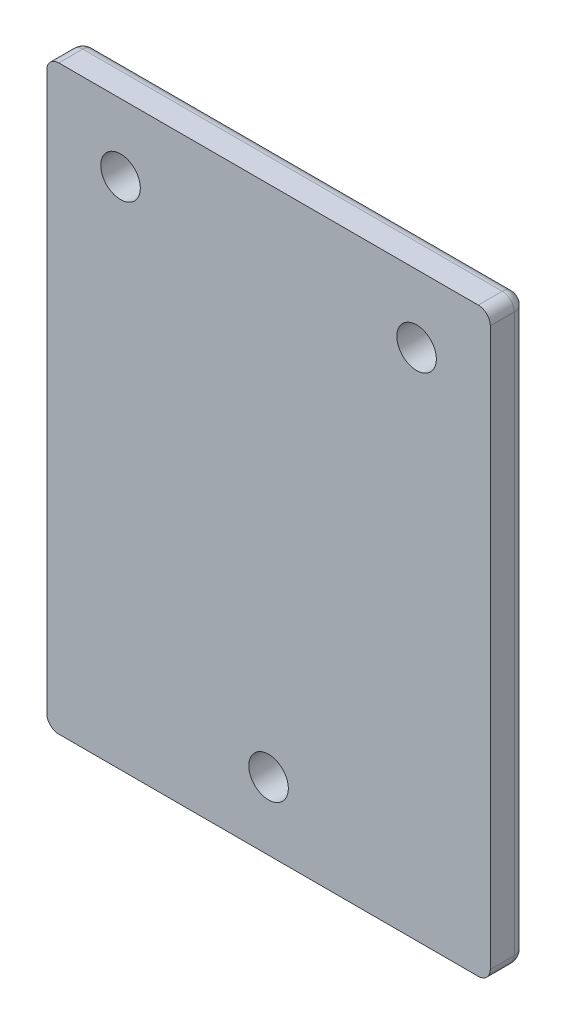
ISO-10303-21;
HEADER;
FILE_DESCRIPTION(('STEP AP214'),'2;1');
FILE_NAME('part.step','',(''),(''),'','','');
FILE_SCHEMA(('AUTOMOTIVE_DESIGN { 1 0 10303 214 1 1 1 1 }'));
ENDSEC;
DATA;
#1=APPLICATION_CONTEXT('core data for automotive mechanical design processes');
#2=APPLICATION_PROTOCOL_DEFINITION('international standard','automotive_design',2000,#1);
#3=PRODUCT_CONTEXT('',#1,'mechanical');
#4=PRODUCT('Part','Part','',(#3));
#5=PRODUCT_RELATED_PRODUCT_CATEGORY('part','',(#4));
#6=PRODUCT_DEFINITION_FORMATION('','',#4);
#7=PRODUCT_DEFINITION_CONTEXT('part definition',#1,'design');
#8=PRODUCT_DEFINITION('design','',#6,#7);
#9=PRODUCT_DEFINITION_SHAPE('','',#8);
#10=(LENGTH_UNIT() NAMED_UNIT(*) SI_UNIT(.MILLI.,.METRE.));
#11=(NAMED_UNIT(*) PLANE_ANGLE_UNIT() SI_UNIT($,.RADIAN.));
#12=(NAMED_UNIT(*) SI_UNIT($,.STERADIAN.) SOLID_ANGLE_UNIT());
#13=UNCERTAINTY_MEASURE_WITH_UNIT(LENGTH_MEASURE(1.E-05),#10,'distance_accuracy_value','');
#14=(GEOMETRIC_REPRESENTATION_CONTEXT(3) GLOBAL_UNCERTAINTY_ASSIGNED_CONTEXT((#13)) GLOBAL_UNIT_ASSIGNED_CONTEXT((#10,
#11,#12)) REPRESENTATION_CONTEXT('',''));
#15=CARTESIAN_POINT('',(0.,0.,0.));
#16=DIRECTION('',(0.,0.,1.));
#17=DIRECTION('',(1.,0.,0.));
#18=AXIS2_PLACEMENT_3D('',#15,#16,#17);
#19=CARTESIAN_POINT('',(0.,0.,3.));
#20=DIRECTION('',(0.,0.,-1.));
#21=DIRECTION('',(-1.,0.,0.));
#22=AXIS2_PLACEMENT_3D('',#19,#20,#21);
#23=PLANE('',#22);
#24=CARTESIAN_POINT('',(12.35,18.6,3.));
#25=DIRECTION('',(0.,0.,-1.));
#26=DIRECTION('',(-1.,0.,0.));
#27=AXIS2_PLACEMENT_3D('',#24,#25,#26);
#28=CIRCLE('',#27,1.64999999999999);
#29=CARTESIAN_POINT('',(10.7,18.6,3.));
#30=VERTEX_POINT('',#29);
#31=EDGE_CURVE('E197',#30,#30,#28,.T.);
#32=ORIENTED_EDGE('',*,*,#31,.T.);
#33=EDGE_LOOP('',(#32));
#34=FACE_BOUND('',#33,.T.);
#35=CARTESIAN_POINT('',(0.,-18.6,3.));
#36=DIRECTION('',(0.,0.,-1.));
#37=DIRECTION('',(-1.,0.,0.));
#38=AXIS2_PLACEMENT_3D('',#35,#36,#37);
#39=CIRCLE('',#38,1.65);
#40=CARTESIAN_POINT('',(-1.65,-18.6,3.));
#41=VERTEX_POINT('',#40);
#42=EDGE_CURVE('E210',#41,#41,#39,.F.);
#43=ORIENTED_EDGE('',*,*,#42,.F.);
#44=EDGE_LOOP('',(#43));
#45=FACE_BOUND('',#44,.T.);
#46=CARTESIAN_POINT('',(-12.35,18.6,3.));
#47=DIRECTION('',(0.,0.,-1.));
#48=DIRECTION('',(-1.,0.,0.));
#49=AXIS2_PLACEMENT_3D('',#46,#47,#48);
#50=CIRCLE('',#49,1.64999999999999);
#51=CARTESIAN_POINT('',(-14.,18.6,3.));
#52=VERTEX_POINT('',#51);
#53=EDGE_CURVE('E216',#52,#52,#50,.F.);
#54=ORIENTED_EDGE('',*,*,#53,.F.);
#55=EDGE_LOOP('',(#54));
#56=FACE_BOUND('',#55,.T.);
#57=DIRECTION('',(-1.,0.,0.));
#58=VECTOR('',#57,1.);
#59=CARTESIAN_POINT('',(-18.5,24.25,3.));
#60=LINE('',#59,#58);
#61=CARTESIAN_POINT('',(17.5,24.25,3.));
#62=VERTEX_POINT('',#61);
#63=CARTESIAN_POINT('',(-17.5,24.25,3.));
#64=VERTEX_POINT('',#63);
#65=EDGE_CURVE('E113',#62,#64,#60,.T.);
#66=ORIENTED_EDGE('',*,*,#65,.T.);
#67=CARTESIAN_POINT('',(-17.5,23.25,3.));
#68=DIRECTION('',(0.,0.,-1.));
#69=DIRECTION('',(-1.,0.,0.));
#70=AXIS2_PLACEMENT_3D('',#67,#68,#69);
#71=CIRCLE('',#70,1.);
#72=CARTESIAN_POINT('',(-18.5,23.25,3.));
#73=VERTEX_POINT('',#72);
#74=EDGE_CURVE('E11',#64,#73,#71,.F.);
#75=ORIENTED_EDGE('',*,*,#74,.T.);
#76=DIRECTION('',(0.,-1.,0.));
#77=VECTOR('',#76,1.);
#78=CARTESIAN_POINT('',(-18.5,-24.25,3.));
#79=LINE('',#78,#77);
#80=CARTESIAN_POINT('',(-18.5,-23.25,3.));
#81=VERTEX_POINT('',#80);
#82=EDGE_CURVE('E127',#73,#81,#79,.T.);
#83=ORIENTED_EDGE('',*,*,#82,.T.);
#84=CARTESIAN_POINT('',(-17.5,-23.25,3.));
#85=DIRECTION('',(0.,0.,-1.));
#86=DIRECTION('',(-1.,0.,0.));
#87=AXIS2_PLACEMENT_3D('',#84,#85,#86);
#88=CIRCLE('',#87,1.);
#89=CARTESIAN_POINT('',(-17.5,-24.25,3.));
#90=VERTEX_POINT('',#89);
#91=EDGE_CURVE('E41',#81,#90,#88,.F.);
#92=ORIENTED_EDGE('',*,*,#91,.T.);
#93=DIRECTION('',(1.,0.,0.));
#94=VECTOR('',#93,1.);
#95=CARTESIAN_POINT('',(-18.5,-24.25,3.));
#96=LINE('',#95,#94);
#97=CARTESIAN_POINT('',(17.5,-24.25,3.));
#98=VERTEX_POINT('',#97);
#99=EDGE_CURVE('E219',#90,#98,#96,.T.);
#100=ORIENTED_EDGE('',*,*,#99,.T.);
#101=CARTESIAN_POINT('',(17.5,-23.25,3.));
#102=DIRECTION('',(0.,0.,-1.));
#103=DIRECTION('',(-1.,0.,0.));
#104=AXIS2_PLACEMENT_3D('',#101,#102,#103);
#105=CIRCLE('',#104,1.);
#106=CARTESIAN_POINT('',(18.5,-23.25,3.));
#107=VERTEX_POINT('',#106);
#108=EDGE_CURVE('E118',#98,#107,#105,.F.);
#109=ORIENTED_EDGE('',*,*,#108,.T.);
#110=DIRECTION('',(0.,1.,0.));
#111=VECTOR('',#110,1.);
#112=CARTESIAN_POINT('',(18.5,-24.25,3.));
#113=LINE('',#112,#111);
#114=CARTESIAN_POINT('',(18.5,23.25,3.));
#115=VERTEX_POINT('',#114);
#116=EDGE_CURVE('E115',#107,#115,#113,.T.);
#117=ORIENTED_EDGE('',*,*,#116,.T.);
#118=CARTESIAN_POINT('',(17.5,23.25,3.));
#119=DIRECTION('',(0.,0.,-1.));
#120=DIRECTION('',(-1.,0.,0.));
#121=AXIS2_PLACEMENT_3D('',#118,#119,#120);
#122=CIRCLE('',#121,1.);
#123=EDGE_CURVE('E111',#115,#62,#122,.F.);
#124=ORIENTED_EDGE('',*,*,#123,.T.);
#125=EDGE_LOOP('',(#66,#75,#83,#92,#100,#109,#117,#124));
#126=FACE_BOUND('',#125,.T.);
#127=ADVANCED_FACE('F32',(#34,#45,#56,#126),#23,.F.);
#128=CARTESIAN_POINT('',(-18.5,-24.25,3.));
#129=DIRECTION('',(0.,1.,0.));
#130=DIRECTION('',(0.,0.,1.));
#131=AXIS2_PLACEMENT_3D('',#128,#129,#130);
#132=PLANE('',#131);
#133=ORIENTED_EDGE('',*,*,#99,.F.);
#134=DIRECTION('',(0.,0.,-1.));
#135=VECTOR('',#134,1.);
#136=CARTESIAN_POINT('',(-17.5,-24.25,3.));
#137=LINE('',#136,#135);
#138=CARTESIAN_POINT('',(-17.5,-24.25,1.));
#139=VERTEX_POINT('',#138);
#140=EDGE_CURVE('E159',#90,#139,#137,.T.);
#141=ORIENTED_EDGE('',*,*,#140,.T.);
#142=DIRECTION('',(1.,0.,0.));
#143=VECTOR('',#142,1.);
#144=CARTESIAN_POINT('',(18.5,-24.25,1.));
#145=LINE('',#144,#143);
#146=CARTESIAN_POINT('',(17.5,-24.25,1.));
#147=VERTEX_POINT('',#146);
#148=EDGE_CURVE('E157',#139,#147,#145,.T.);
#149=ORIENTED_EDGE('',*,*,#148,.T.);
#150=DIRECTION('',(0.,0.,-1.));
#151=VECTOR('',#150,1.);
#152=CARTESIAN_POINT('',(17.5,-24.25,3.));
#153=LINE('',#152,#151);
#154=EDGE_CURVE('E155',#147,#98,#153,.F.);
#155=ORIENTED_EDGE('',*,*,#154,.T.);
#156=EDGE_LOOP('',(#133,#141,#149,#155));
#157=FACE_BOUND('',#156,.T.);
#158=ADVANCED_FACE('F270',(#157),#132,.F.);
#159=CARTESIAN_POINT('',(18.5,-24.25,3.));
#160=DIRECTION('',(-1.,0.,0.));
#161=DIRECTION('',(0.,0.,1.));
#162=AXIS2_PLACEMENT_3D('',#159,#160,#161);
#163=PLANE('',#162);
#164=DIRECTION('',(0.,1.,0.));
#165=VECTOR('',#164,1.);
#166=CARTESIAN_POINT('',(18.5,24.25,1.));
#167=LINE('',#166,#165);
#168=CARTESIAN_POINT('',(18.5,-23.25,1.));
#169=VERTEX_POINT('',#168);
#170=CARTESIAN_POINT('',(18.5,23.25,1.));
#171=VERTEX_POINT('',#170);
#172=EDGE_CURVE('E49',#169,#171,#167,.T.);
#173=ORIENTED_EDGE('',*,*,#172,.T.);
#174=DIRECTION('',(0.,0.,-1.));
#175=VECTOR('',#174,1.);
#176=CARTESIAN_POINT('',(18.5,23.25,3.));
#177=LINE('',#176,#175);
#178=EDGE_CURVE('E163',#171,#115,#177,.F.);
#179=ORIENTED_EDGE('',*,*,#178,.T.);
#180=ORIENTED_EDGE('',*,*,#116,.F.);
#181=DIRECTION('',(0.,0.,-1.));
#182=VECTOR('',#181,1.);
#183=CARTESIAN_POINT('',(18.5,-23.25,3.));
#184=LINE('',#183,#182);
#185=EDGE_CURVE('E54',#107,#169,#184,.T.);
#186=ORIENTED_EDGE('',*,*,#185,.T.);
#187=EDGE_LOOP('',(#173,#179,#180,#186));
#188=FACE_BOUND('',#187,.T.);
#189=ADVANCED_FACE('F272',(#188),#163,.F.);
#190=CARTESIAN_POINT('',(-18.5,24.25,3.));
#191=DIRECTION('',(0.,-1.,0.));
#192=DIRECTION('',(1.,0.,0.));
#193=AXIS2_PLACEMENT_3D('',#190,#191,#192);
#194=PLANE('',#193);
#195=DIRECTION('',(-1.,0.,0.));
#196=VECTOR('',#195,1.);
#197=CARTESIAN_POINT('',(-18.5,24.25,1.));
#198=LINE('',#197,#196);
#199=CARTESIAN_POINT('',(17.5,24.25,1.));
#200=VERTEX_POINT('',#199);
#201=CARTESIAN_POINT('',(-17.5,24.25,1.));
#202=VERTEX_POINT('',#201);
#203=EDGE_CURVE('E133',#200,#202,#198,.T.);
#204=ORIENTED_EDGE('',*,*,#203,.T.);
#205=DIRECTION('',(0.,0.,-1.));
#206=VECTOR('',#205,1.);
#207=CARTESIAN_POINT('',(-17.5,24.25,3.));
#208=LINE('',#207,#206);
#209=EDGE_CURVE('E126',#202,#64,#208,.F.);
#210=ORIENTED_EDGE('',*,*,#209,.T.);
#211=ORIENTED_EDGE('',*,*,#65,.F.);
#212=DIRECTION('',(0.,0.,-1.));
#213=VECTOR('',#212,1.);
#214=CARTESIAN_POINT('',(17.5,24.25,3.));
#215=LINE('',#214,#213);
#216=EDGE_CURVE('E123',#62,#200,#215,.T.);
#217=ORIENTED_EDGE('',*,*,#216,.T.);
#218=EDGE_LOOP('',(#204,#210,#211,#217));
#219=FACE_BOUND('',#218,.T.);
#220=ADVANCED_FACE('F122',(#219),#194,.F.);
#221=CARTESIAN_POINT('',(-18.5,-24.25,3.));
#222=DIRECTION('',(1.,0.,0.));
#223=DIRECTION('',(0.,0.,-1.));
#224=AXIS2_PLACEMENT_3D('',#221,#222,#223);
#225=PLANE('',#224);
#226=ORIENTED_EDGE('',*,*,#82,.F.);
#227=DIRECTION('',(0.,0.,-1.));
#228=VECTOR('',#227,1.);
#229=CARTESIAN_POINT('',(-18.5,23.25,3.));
#230=LINE('',#229,#228);
#231=CARTESIAN_POINT('',(-18.5,23.25,1.));
#232=VERTEX_POINT('',#231);
#233=EDGE_CURVE('E153',#73,#232,#230,.T.);
#234=ORIENTED_EDGE('',*,*,#233,.T.);
#235=DIRECTION('',(0.,-1.,0.));
#236=VECTOR('',#235,1.);
#237=CARTESIAN_POINT('',(-18.5,-24.25,1.));
#238=LINE('',#237,#236);
#239=CARTESIAN_POINT('',(-18.5,-23.25,1.));
#240=VERTEX_POINT('',#239);
#241=EDGE_CURVE('E151',#232,#240,#238,.T.);
#242=ORIENTED_EDGE('',*,*,#241,.T.);
#243=DIRECTION('',(0.,0.,-1.));
#244=VECTOR('',#243,1.);
#245=CARTESIAN_POINT('',(-18.5,-23.25,3.));
#246=LINE('',#245,#244);
#247=EDGE_CURVE('E149',#240,#81,#246,.F.);
#248=ORIENTED_EDGE('',*,*,#247,.T.);
#249=EDGE_LOOP('',(#226,#234,#242,#248));
#250=FACE_BOUND('',#249,.T.);
#251=ADVANCED_FACE('F250',(#250),#225,.F.);
#252=CARTESIAN_POINT('',(0.,0.,0.));
#253=DIRECTION('',(0.,0.,-1.));
#254=DIRECTION('',(-1.,0.,0.));
#255=AXIS2_PLACEMENT_3D('',#252,#253,#254);
#256=PLANE('',#255);
#257=DIRECTION('',(0.,-1.,0.));
#258=VECTOR('',#257,1.);
#259=CARTESIAN_POINT('',(-17.5,24.25,0.));
#260=LINE('',#259,#258);
#261=CARTESIAN_POINT('',(-17.5,-23.25,0.));
#262=VERTEX_POINT('',#261);
#263=CARTESIAN_POINT('',(-17.5,23.25,0.));
#264=VERTEX_POINT('',#263);
#265=EDGE_CURVE('E144',#262,#264,#260,.F.);
#266=ORIENTED_EDGE('',*,*,#265,.T.);
#267=DIRECTION('',(-1.,0.,0.));
#268=VECTOR('',#267,1.);
#269=CARTESIAN_POINT('',(18.5,23.25,0.));
#270=LINE('',#269,#268);
#271=CARTESIAN_POINT('',(17.5,23.25,0.));
#272=VERTEX_POINT('',#271);
#273=EDGE_CURVE('E146',#264,#272,#270,.F.);
#274=ORIENTED_EDGE('',*,*,#273,.T.);
#275=DIRECTION('',(0.,1.,0.));
#276=VECTOR('',#275,1.);
#277=CARTESIAN_POINT('',(17.5,-24.25,0.));
#278=LINE('',#277,#276);
#279=CARTESIAN_POINT('',(17.5,-23.25,0.));
#280=VERTEX_POINT('',#279);
#281=EDGE_CURVE('E140',#272,#280,#278,.F.);
#282=ORIENTED_EDGE('',*,*,#281,.T.);
#283=DIRECTION('',(1.,0.,0.));
#284=VECTOR('',#283,1.);
#285=CARTESIAN_POINT('',(-18.5,-23.25,0.));
#286=LINE('',#285,#284);
#287=EDGE_CURVE('E142',#280,#262,#286,.F.);
#288=ORIENTED_EDGE('',*,*,#287,.T.);
#289=EDGE_LOOP('',(#266,#274,#282,#288));
#290=FACE_BOUND('',#289,.T.);
#291=CARTESIAN_POINT('',(12.35,18.6,0.));
#292=DIRECTION('',(0.,0.,1.));
#293=DIRECTION('',(1.,0.,0.));
#294=AXIS2_PLACEMENT_3D('',#291,#292,#293);
#295=CIRCLE('',#294,1.64999999999999);
#296=CARTESIAN_POINT('',(10.7,18.6,0.));
#297=VERTEX_POINT('',#296);
#298=EDGE_CURVE('E200',#297,#297,#295,.T.);
#299=ORIENTED_EDGE('',*,*,#298,.T.);
#300=EDGE_LOOP('',(#299));
#301=FACE_BOUND('',#300,.T.);
#302=CARTESIAN_POINT('',(0.,-18.6,0.));
#303=DIRECTION('',(0.,0.,-1.));
#304=DIRECTION('',(-1.,0.,0.));
#305=AXIS2_PLACEMENT_3D('',#302,#303,#304);
#306=CIRCLE('',#305,1.65);
#307=CARTESIAN_POINT('',(-1.65,-18.6,0.));
#308=VERTEX_POINT('',#307);
#309=EDGE_CURVE('E205',#308,#308,#306,.T.);
#310=ORIENTED_EDGE('',*,*,#309,.F.);
#311=EDGE_LOOP('',(#310));
#312=FACE_BOUND('',#311,.T.);
#313=CARTESIAN_POINT('',(-12.35,18.6,0.));
#314=DIRECTION('',(0.,0.,-1.));
#315=DIRECTION('',(-1.,0.,0.));
#316=AXIS2_PLACEMENT_3D('',#313,#314,#315);
#317=CIRCLE('',#316,1.64999999999999);
#318=CARTESIAN_POINT('',(-14.,18.6,0.));
#319=VERTEX_POINT('',#318);
#320=EDGE_CURVE('E213',#319,#319,#317,.T.);
#321=ORIENTED_EDGE('',*,*,#320,.F.);
#322=EDGE_LOOP('',(#321));
#323=FACE_BOUND('',#322,.T.);
#324=ADVANCED_FACE('F264',(#290,#301,#312,#323),#256,.T.);
#325=CARTESIAN_POINT('',(-12.35,18.6,3.001));
#326=DIRECTION('',(0.,0.,-1.));
#327=DIRECTION('',(-1.,0.,0.));
#328=AXIS2_PLACEMENT_3D('',#325,#326,#327);
#329=CYLINDRICAL_SURFACE('',#328,1.64999999999999);
#330=CARTESIAN_POINT('',(-14.,18.6,0.));
#331=CARTESIAN_POINT('',(-14.,18.6,0.0312500000000005));
#332=CARTESIAN_POINT('',(-14.,18.6,0.0625000000000005));
#333=CARTESIAN_POINT('',(-14.,18.6,0.125000000000001));
#334=CARTESIAN_POINT('',(-14.,18.6,0.156250000000001));
#335=CARTESIAN_POINT('',(-14.,18.6,0.218750000000001));
#336=CARTESIAN_POINT('',(-14.,18.6,0.250000000000001));
#337=CARTESIAN_POINT('',(-14.,18.6,0.312500000000001));
#338=CARTESIAN_POINT('',(-14.,18.6,0.34375));
#339=CARTESIAN_POINT('',(-14.,18.6,0.40625));
#340=CARTESIAN_POINT('',(-14.,18.6,0.4375));
#341=CARTESIAN_POINT('',(-14.,18.6,0.5));
#342=CARTESIAN_POINT('',(-14.,18.6,0.53125));
#343=CARTESIAN_POINT('',(-14.,18.6,0.593750000000001));
#344=CARTESIAN_POINT('',(-14.,18.6,0.625000000000001));
#345=CARTESIAN_POINT('',(-14.,18.6,0.687500000000001));
#346=CARTESIAN_POINT('',(-14.,18.6,0.71875));
#347=CARTESIAN_POINT('',(-14.,18.6,0.78125));
#348=CARTESIAN_POINT('',(-14.,18.6,0.8125));
#349=CARTESIAN_POINT('',(-14.,18.6,0.875));
#350=CARTESIAN_POINT('',(-14.,18.6,0.90625));
#351=CARTESIAN_POINT('',(-14.,18.6,0.96875));
#352=CARTESIAN_POINT('',(-14.,18.6,1.));
#353=CARTESIAN_POINT('',(-14.,18.6,1.0625));
#354=CARTESIAN_POINT('',(-14.,18.6,1.09375));
#355=CARTESIAN_POINT('',(-14.,18.6,1.15625));
#356=CARTESIAN_POINT('',(-14.,18.6,1.1875));
#357=CARTESIAN_POINT('',(-14.,18.6,1.25));
#358=CARTESIAN_POINT('',(-14.,18.6,1.28125));
#359=CARTESIAN_POINT('',(-14.,18.6,1.34375));
#360=CARTESIAN_POINT('',(-14.,18.6,1.375));
#361=CARTESIAN_POINT('',(-14.,18.6,1.4375));
#362=CARTESIAN_POINT('',(-14.,18.6,1.46875));
#363=CARTESIAN_POINT('',(-14.,18.6,1.53125));
#364=CARTESIAN_POINT('',(-14.,18.6,1.5625));
#365=CARTESIAN_POINT('',(-14.,18.6,1.625));
#366=CARTESIAN_POINT('',(-14.,18.6,1.65625));
#367=CARTESIAN_POINT('',(-14.,18.6,1.71875));
#368=CARTESIAN_POINT('',(-14.,18.6,1.75));
#369=CARTESIAN_POINT('',(-14.,18.6,1.8125));
#370=CARTESIAN_POINT('',(-14.,18.6,1.84375));
#371=CARTESIAN_POINT('',(-14.,18.6,1.90625));
#372=CARTESIAN_POINT('',(-14.,18.6,1.9375));
#373=CARTESIAN_POINT('',(-14.,18.6,2.));
#374=CARTESIAN_POINT('',(-14.,18.6,2.03125));
#375=CARTESIAN_POINT('',(-14.,18.6,2.09375));
#376=CARTESIAN_POINT('',(-14.,18.6,2.125));
#377=CARTESIAN_POINT('',(-14.,18.6,2.1875));
#378=CARTESIAN_POINT('',(-14.,18.6,2.21875));
#379=CARTESIAN_POINT('',(-14.,18.6,2.28125));
#380=CARTESIAN_POINT('',(-14.,18.6,2.3125));
#381=CARTESIAN_POINT('',(-14.,18.6,2.375));
#382=CARTESIAN_POINT('',(-14.,18.6,2.40625));
#383=CARTESIAN_POINT('',(-14.,18.6,2.46875));
#384=CARTESIAN_POINT('',(-14.,18.6,2.5));
#385=CARTESIAN_POINT('',(-14.,18.6,2.5625));
#386=CARTESIAN_POINT('',(-14.,18.6,2.59375));
#387=CARTESIAN_POINT('',(-14.,18.6,2.65625));
#388=CARTESIAN_POINT('',(-14.,18.6,2.6875));
#389=CARTESIAN_POINT('',(-14.,18.6,2.75));
#390=CARTESIAN_POINT('',(-14.,18.6,2.78125));
#391=CARTESIAN_POINT('',(-14.,18.6,2.84375));
#392=CARTESIAN_POINT('',(-14.,18.6,2.875));
#393=CARTESIAN_POINT('',(-14.,18.6,2.9375));
#394=CARTESIAN_POINT('',(-14.,18.6,2.96875));
#395=CARTESIAN_POINT('',(-14.,18.6,3.));
#396=B_SPLINE_CURVE_WITH_KNOTS('',3,(#330,#331,#332,#333,#334,#335,#336,#337,#338,#339,#340,
#341,#342,#343,#344,#345,#346,#347,#348,#349,#350,#351,#352,#353,#354,#355,#356,#357,#358,#359,
#360,#361,#362,#363,#364,#365,#366,#367,#368,#369,#370,#371,#372,#373,#374,#375,#376,#377,#378,
#379,#380,#381,#382,#383,#384,#385,#386,#387,#388,#389,#390,#391,#392,#393,#394,#395),
.UNSPECIFIED.,.F.,.F.,(4,2,2,2,2,2,2,2,2,2,2,2,2,2,2,2,2,2,2,2,2,2,2,2,2,2,2,2,2,2,2,2,4),(0.,
0.0937500000000001,0.1875,0.28125,0.375,0.46875,0.5625,0.65625,0.75,0.84375,0.9375,1.03125,
1.125,1.21875,1.3125,1.40625,1.5,1.59375,1.6875,1.78125,1.875,1.96875,2.0625,2.15625,2.25,
2.34375,2.4375,2.53125,2.625,2.71875,2.8125,2.90625,3.),.UNSPECIFIED.);
#397=EDGE_CURVE('BSEAM284',#319,#52,#396,.T.);
#398=ORIENTED_EDGE('',*,*,#320,.T.);
#399=ORIENTED_EDGE('',*,*,#53,.T.);
#400=ORIENTED_EDGE('',*,*,#397,.T.);
#401=ORIENTED_EDGE('',*,*,#397,.F.);
#402=EDGE_LOOP('',(#398,#400,#399,#401));
#403=FACE_BOUND('',#402,.T.);
#404=ADVANCED_FACE('F284',(#403),#329,.F.);
#405=CARTESIAN_POINT('',(0.,-18.6,3.001));
#406=DIRECTION('',(0.,0.,-1.));
#407=DIRECTION('',(-1.,0.,0.));
#408=AXIS2_PLACEMENT_3D('',#405,#406,#407);
#409=CYLINDRICAL_SURFACE('',#408,1.65);
#410=CARTESIAN_POINT('',(-1.65,-18.6,0.));
#411=CARTESIAN_POINT('',(-1.65,-18.6,0.0312500000000005));
#412=CARTESIAN_POINT('',(-1.65,-18.6,0.0625000000000005));
#413=CARTESIAN_POINT('',(-1.65,-18.6,0.125000000000001));
#414=CARTESIAN_POINT('',(-1.65,-18.6,0.156250000000001));
#415=CARTESIAN_POINT('',(-1.65,-18.6,0.218750000000001));
#416=CARTESIAN_POINT('',(-1.65,-18.6,0.250000000000001));
#417=CARTESIAN_POINT('',(-1.65,-18.6,0.312500000000001));
#418=CARTESIAN_POINT('',(-1.65,-18.6,0.34375));
#419=CARTESIAN_POINT('',(-1.65,-18.6,0.40625));
#420=CARTESIAN_POINT('',(-1.65,-18.6,0.4375));
#421=CARTESIAN_POINT('',(-1.65,-18.6,0.5));
#422=CARTESIAN_POINT('',(-1.65,-18.6,0.53125));
#423=CARTESIAN_POINT('',(-1.65,-18.6,0.593750000000001));
#424=CARTESIAN_POINT('',(-1.65,-18.6,0.625000000000001));
#425=CARTESIAN_POINT('',(-1.65,-18.6,0.687500000000001));
#426=CARTESIAN_POINT('',(-1.65,-18.6,0.71875));
#427=CARTESIAN_POINT('',(-1.65,-18.6,0.78125));
#428=CARTESIAN_POINT('',(-1.65,-18.6,0.8125));
#429=CARTESIAN_POINT('',(-1.65,-18.6,0.875));
#430=CARTESIAN_POINT('',(-1.65,-18.6,0.90625));
#431=CARTESIAN_POINT('',(-1.65,-18.6,0.96875));
#432=CARTESIAN_POINT('',(-1.65,-18.6,1.));
#433=CARTESIAN_POINT('',(-1.65,-18.6,1.0625));
#434=CARTESIAN_POINT('',(-1.65,-18.6,1.09375));
#435=CARTESIAN_POINT('',(-1.65,-18.6,1.15625));
#436=CARTESIAN_POINT('',(-1.65,-18.6,1.1875));
#437=CARTESIAN_POINT('',(-1.65,-18.6,1.25));
#438=CARTESIAN_POINT('',(-1.65,-18.6,1.28125));
#439=CARTESIAN_POINT('',(-1.65,-18.6,1.34375));
#440=CARTESIAN_POINT('',(-1.65,-18.6,1.375));
#441=CARTESIAN_POINT('',(-1.65,-18.6,1.4375));
#442=CARTESIAN_POINT('',(-1.65,-18.6,1.46875));
#443=CARTESIAN_POINT('',(-1.65,-18.6,1.53125));
#444=CARTESIAN_POINT('',(-1.65,-18.6,1.5625));
#445=CARTESIAN_POINT('',(-1.65,-18.6,1.625));
#446=CARTESIAN_POINT('',(-1.65,-18.6,1.65625));
#447=CARTESIAN_POINT('',(-1.65,-18.6,1.71875));
#448=CARTESIAN_POINT('',(-1.65,-18.6,1.75));
#449=CARTESIAN_POINT('',(-1.65,-18.6,1.8125));
#450=CARTESIAN_POINT('',(-1.65,-18.6,1.84375));
#451=CARTESIAN_POINT('',(-1.65,-18.6,1.90625));
#452=CARTESIAN_POINT('',(-1.65,-18.6,1.9375));
#453=CARTESIAN_POINT('',(-1.65,-18.6,2.));
#454=CARTESIAN_POINT('',(-1.65,-18.6,2.03125));
#455=CARTESIAN_POINT('',(-1.65,-18.6,2.09375));
#456=CARTESIAN_POINT('',(-1.65,-18.6,2.125));
#457=CARTESIAN_POINT('',(-1.65,-18.6,2.1875));
#458=CARTESIAN_POINT('',(-1.65,-18.6,2.21875));
#459=CARTESIAN_POINT('',(-1.65,-18.6,2.28125));
#460=CARTESIAN_POINT('',(-1.65,-18.6,2.3125));
#461=CARTESIAN_POINT('',(-1.65,-18.6,2.375));
#462=CARTESIAN_POINT('',(-1.65,-18.6,2.40625));
#463=CARTESIAN_POINT('',(-1.65,-18.6,2.46875));
#464=CARTESIAN_POINT('',(-1.65,-18.6,2.5));
#465=CARTESIAN_POINT('',(-1.65,-18.6,2.5625));
#466=CARTESIAN_POINT('',(-1.65,-18.6,2.59375));
#467=CARTESIAN_POINT('',(-1.65,-18.6,2.65625));
#468=CARTESIAN_POINT('',(-1.65,-18.6,2.6875));
#469=CARTESIAN_POINT('',(-1.65,-18.6,2.75));
#470=CARTESIAN_POINT('',(-1.65,-18.6,2.78125));
#471=CARTESIAN_POINT('',(-1.65,-18.6,2.84375));
#472=CARTESIAN_POINT('',(-1.65,-18.6,2.875));
#473=CARTESIAN_POINT('',(-1.65,-18.6,2.9375));
#474=CARTESIAN_POINT('',(-1.65,-18.6,2.96875));
#475=CARTESIAN_POINT('',(-1.65,-18.6,3.));
#476=B_SPLINE_CURVE_WITH_KNOTS('',3,(#410,#411,#412,#413,#414,#415,#416,#417,#418,#419,#420,
#421,#422,#423,#424,#425,#426,#427,#428,#429,#430,#431,#432,#433,#434,#435,#436,#437,#438,#439,
#440,#441,#442,#443,#444,#445,#446,#447,#448,#449,#450,#451,#452,#453,#454,#455,#456,#457,#458,
#459,#460,#461,#462,#463,#464,#465,#466,#467,#468,#469,#470,#471,#472,#473,#474,#475),
.UNSPECIFIED.,.F.,.F.,(4,2,2,2,2,2,2,2,2,2,2,2,2,2,2,2,2,2,2,2,2,2,2,2,2,2,2,2,2,2,2,2,4),(0.,
0.0937500000000001,0.1875,0.28125,0.375,0.46875,0.5625,0.65625,0.75,0.84375,0.9375,1.03125,
1.125,1.21875,1.3125,1.40625,1.5,1.59375,1.6875,1.78125,1.875,1.96875,2.0625,2.15625,2.25,
2.34375,2.4375,2.53125,2.625,2.71875,2.8125,2.90625,3.),.UNSPECIFIED.);
#477=EDGE_CURVE('BSEAM312',#308,#41,#476,.T.);
#478=ORIENTED_EDGE('',*,*,#309,.T.);
#479=ORIENTED_EDGE('',*,*,#42,.T.);
#480=ORIENTED_EDGE('',*,*,#477,.T.);
#481=ORIENTED_EDGE('',*,*,#477,.F.);
#482=EDGE_LOOP('',(#478,#480,#479,#481));
#483=FACE_BOUND('',#482,.T.);
#484=ADVANCED_FACE('F312',(#483),#409,.F.);
#485=CARTESIAN_POINT('',(12.35,18.6,3.001));
#486=DIRECTION('',(0.,0.,-1.));
#487=DIRECTION('',(-1.,0.,0.));
#488=AXIS2_PLACEMENT_3D('',#485,#486,#487);
#489=CYLINDRICAL_SURFACE('',#488,1.64999999999999);
#490=CARTESIAN_POINT('',(10.7,18.6,0.));
#491=CARTESIAN_POINT('',(10.7,18.6,0.0312499999999996));
#492=CARTESIAN_POINT('',(10.7,18.6,0.0624999999999996));
#493=CARTESIAN_POINT('',(10.7,18.6,0.125));
#494=CARTESIAN_POINT('',(10.7,18.6,0.15625));
#495=CARTESIAN_POINT('',(10.7,18.6,0.21875));
#496=CARTESIAN_POINT('',(10.7,18.6,0.25));
#497=CARTESIAN_POINT('',(10.7,18.6,0.3125));
#498=CARTESIAN_POINT('',(10.7,18.6,0.34375));
#499=CARTESIAN_POINT('',(10.7,18.6,0.40625));
#500=CARTESIAN_POINT('',(10.7,18.6,0.4375));
#501=CARTESIAN_POINT('',(10.7,18.6,0.5));
#502=CARTESIAN_POINT('',(10.7,18.6,0.53125));
#503=CARTESIAN_POINT('',(10.7,18.6,0.59375));
#504=CARTESIAN_POINT('',(10.7,18.6,0.625));
#505=CARTESIAN_POINT('',(10.7,18.6,0.6875));
#506=CARTESIAN_POINT('',(10.7,18.6,0.71875));
#507=CARTESIAN_POINT('',(10.7,18.6,0.78125));
#508=CARTESIAN_POINT('',(10.7,18.6,0.8125));
#509=CARTESIAN_POINT('',(10.7,18.6,0.875));
#510=CARTESIAN_POINT('',(10.7,18.6,0.90625));
#511=CARTESIAN_POINT('',(10.7,18.6,0.96875));
#512=CARTESIAN_POINT('',(10.7,18.6,1.));
#513=CARTESIAN_POINT('',(10.7,18.6,1.0625));
#514=CARTESIAN_POINT('',(10.7,18.6,1.09375));
#515=CARTESIAN_POINT('',(10.7,18.6,1.15625));
#516=CARTESIAN_POINT('',(10.7,18.6,1.1875));
#517=CARTESIAN_POINT('',(10.7,18.6,1.25));
#518=CARTESIAN_POINT('',(10.7,18.6,1.28125));
#519=CARTESIAN_POINT('',(10.7,18.6,1.34375));
#520=CARTESIAN_POINT('',(10.7,18.6,1.375));
#521=CARTESIAN_POINT('',(10.7,18.6,1.4375));
#522=CARTESIAN_POINT('',(10.7,18.6,1.46875));
#523=CARTESIAN_POINT('',(10.7,18.6,1.53125));
#524=CARTESIAN_POINT('',(10.7,18.6,1.5625));
#525=CARTESIAN_POINT('',(10.7,18.6,1.625));
#526=CARTESIAN_POINT('',(10.7,18.6,1.65625));
#527=CARTESIAN_POINT('',(10.7,18.6,1.71875));
#528=CARTESIAN_POINT('',(10.7,18.6,1.75));
#529=CARTESIAN_POINT('',(10.7,18.6,1.8125));
#530=CARTESIAN_POINT('',(10.7,18.6,1.84375));
#531=CARTESIAN_POINT('',(10.7,18.6,1.90625));
#532=CARTESIAN_POINT('',(10.7,18.6,1.9375));
#533=CARTESIAN_POINT('',(10.7,18.6,2.));
#534=CARTESIAN_POINT('',(10.7,18.6,2.03125));
#535=CARTESIAN_POINT('',(10.7,18.6,2.09375));
#536=CARTESIAN_POINT('',(10.7,18.6,2.125));
#537=CARTESIAN_POINT('',(10.7,18.6,2.1875));
#538=CARTESIAN_POINT('',(10.7,18.6,2.21875));
#539=CARTESIAN_POINT('',(10.7,18.6,2.28125));
#540=CARTESIAN_POINT('',(10.7,18.6,2.3125));
#541=CARTESIAN_POINT('',(10.7,18.6,2.375));
#542=CARTESIAN_POINT('',(10.7,18.6,2.40625));
#543=CARTESIAN_POINT('',(10.7,18.6,2.46875));
#544=CARTESIAN_POINT('',(10.7,18.6,2.5));
#545=CARTESIAN_POINT('',(10.7,18.6,2.5625));
#546=CARTESIAN_POINT('',(10.7,18.6,2.59375));
#547=CARTESIAN_POINT('',(10.7,18.6,2.65625));
#548=CARTESIAN_POINT('',(10.7,18.6,2.6875));
#549=CARTESIAN_POINT('',(10.7,18.6,2.75));
#550=CARTESIAN_POINT('',(10.7,18.6,2.78125));
#551=CARTESIAN_POINT('',(10.7,18.6,2.84375));
#552=CARTESIAN_POINT('',(10.7,18.6,2.875));
#553=CARTESIAN_POINT('',(10.7,18.6,2.9375));
#554=CARTESIAN_POINT('',(10.7,18.6,2.96875));
#555=CARTESIAN_POINT('',(10.7,18.6,3.));
#556=B_SPLINE_CURVE_WITH_KNOTS('',3,(#490,#491,#492,#493,#494,#495,#496,#497,#498,#499,#500,
#501,#502,#503,#504,#505,#506,#507,#508,#509,#510,#511,#512,#513,#514,#515,#516,#517,#518,#519,
#520,#521,#522,#523,#524,#525,#526,#527,#528,#529,#530,#531,#532,#533,#534,#535,#536,#537,#538,
#539,#540,#541,#542,#543,#544,#545,#546,#547,#548,#549,#550,#551,#552,#553,#554,#555),
.UNSPECIFIED.,.F.,.F.,(4,2,2,2,2,2,2,2,2,2,2,2,2,2,2,2,2,2,2,2,2,2,2,2,2,2,2,2,2,2,2,2,4),(0.,
0.0937500000000001,0.1875,0.28125,0.375,0.46875,0.5625,0.65625,0.75,0.84375,0.9375,1.03125,
1.125,1.21875,1.3125,1.40625,1.5,1.59375,1.6875,1.78125,1.875,1.96875,2.0625,2.15625,2.25,
2.34375,2.4375,2.53125,2.625,2.71875,2.8125,2.90625,3.),.UNSPECIFIED.);
#557=EDGE_CURVE('BSEAM308',#297,#30,#556,.T.);
#558=ORIENTED_EDGE('',*,*,#298,.F.);
#559=ORIENTED_EDGE('',*,*,#31,.F.);
#560=ORIENTED_EDGE('',*,*,#557,.T.);
#561=ORIENTED_EDGE('',*,*,#557,.F.);
#562=EDGE_LOOP('',(#558,#560,#559,#561));
#563=FACE_BOUND('',#562,.T.);
#564=ADVANCED_FACE('F308',(#563),#489,.F.);
#565=CARTESIAN_POINT('',(17.5,-23.25,3.));
#566=DIRECTION('',(0.,0.,-1.));
#567=DIRECTION('',(-1.,0.,0.));
#568=AXIS2_PLACEMENT_3D('',#565,#566,#567);
#569=CYLINDRICAL_SURFACE('',#568,1.);
#570=ORIENTED_EDGE('',*,*,#108,.F.);
#571=ORIENTED_EDGE('',*,*,#154,.F.);
#572=CARTESIAN_POINT('',(17.5,-23.25,1.));
#573=DIRECTION('',(0.,0.,-1.));
#574=DIRECTION('',(-1.,0.,0.));
#575=AXIS2_PLACEMENT_3D('',#572,#573,#574);
#576=CIRCLE('',#575,1.);
#577=EDGE_CURVE('E192',#169,#147,#576,.T.);
#578=ORIENTED_EDGE('',*,*,#577,.F.);
#579=ORIENTED_EDGE('',*,*,#185,.F.);
#580=EDGE_LOOP('',(#570,#571,#578,#579));
#581=FACE_BOUND('',#580,.T.);
#582=ADVANCED_FACE('F34',(#581),#569,.T.);
#583=CARTESIAN_POINT('',(-17.5,-23.25,3.));
#584=DIRECTION('',(0.,0.,-1.));
#585=DIRECTION('',(-1.,0.,0.));
#586=AXIS2_PLACEMENT_3D('',#583,#584,#585);
#587=CYLINDRICAL_SURFACE('',#586,1.);
#588=ORIENTED_EDGE('',*,*,#91,.F.);
#589=ORIENTED_EDGE('',*,*,#247,.F.);
#590=CARTESIAN_POINT('',(-17.5,-23.25,1.));
#591=DIRECTION('',(0.,0.,-1.));
#592=DIRECTION('',(-1.,0.,0.));
#593=AXIS2_PLACEMENT_3D('',#590,#591,#592);
#594=CIRCLE('',#593,1.);
#595=EDGE_CURVE('E190',#139,#240,#594,.T.);
#596=ORIENTED_EDGE('',*,*,#595,.F.);
#597=ORIENTED_EDGE('',*,*,#140,.F.);
#598=EDGE_LOOP('',(#588,#589,#596,#597));
#599=FACE_BOUND('',#598,.T.);
#600=ADVANCED_FACE('F255',(#599),#587,.T.);
#601=CARTESIAN_POINT('',(-18.5,-23.25,1.));
#602=DIRECTION('',(-1.,0.,0.));
#603=DIRECTION('',(0.,0.,1.));
#604=AXIS2_PLACEMENT_3D('',#601,#602,#603);
#605=CYLINDRICAL_SURFACE('',#604,1.);
#606=CARTESIAN_POINT('',(17.5,-23.25,1.));
#607=DIRECTION('',(1.,0.,0.));
#608=DIRECTION('',(0.,0.,-1.));
#609=AXIS2_PLACEMENT_3D('',#606,#607,#608);
#610=CIRCLE('',#609,1.);
#611=EDGE_CURVE('E36',#147,#280,#610,.T.);
#612=ORIENTED_EDGE('',*,*,#611,.F.);
#613=ORIENTED_EDGE('',*,*,#148,.F.);
#614=CARTESIAN_POINT('',(-17.5,-23.25,1.));
#615=DIRECTION('',(-1.,0.,0.));
#616=DIRECTION('',(0.,0.,1.));
#617=AXIS2_PLACEMENT_3D('',#614,#615,#616);
#618=CIRCLE('',#617,1.);
#619=EDGE_CURVE('E187',#262,#139,#618,.T.);
#620=ORIENTED_EDGE('',*,*,#619,.F.);
#621=ORIENTED_EDGE('',*,*,#287,.F.);
#622=EDGE_LOOP('',(#612,#613,#620,#621));
#623=FACE_BOUND('',#622,.T.);
#624=ADVANCED_FACE('F269',(#623),#605,.T.);
#625=CARTESIAN_POINT('',(17.5,-23.25,1.));
#626=DIRECTION('',(0.,0.,1.));
#627=DIRECTION('',(1.,0.,0.));
#628=AXIS2_PLACEMENT_3D('',#625,#626,#627);
#629=SPHERICAL_SURFACE('',#628,1.);
#630=ORIENTED_EDGE('',*,*,#577,.T.);
#631=ORIENTED_EDGE('',*,*,#611,.T.);
#632=CARTESIAN_POINT('',(17.5,-23.25,1.));
#633=DIRECTION('',(0.,-1.,0.));
#634=DIRECTION('',(0.,0.,-1.));
#635=AXIS2_PLACEMENT_3D('',#632,#633,#634);
#636=CIRCLE('',#635,1.);
#637=EDGE_CURVE('E184',#169,#280,#636,.F.);
#638=ORIENTED_EDGE('',*,*,#637,.F.);
#639=EDGE_LOOP('',(#630,#631,#638));
#640=FACE_BOUND('',#639,.T.);
#641=ADVANCED_FACE('F229',(#640),#629,.T.);
#642=CARTESIAN_POINT('',(-17.5,-23.25,1.));
#643=DIRECTION('',(0.,0.,1.));
#644=DIRECTION('',(1.,0.,0.));
#645=AXIS2_PLACEMENT_3D('',#642,#643,#644);
#646=SPHERICAL_SURFACE('',#645,1.);
#647=ORIENTED_EDGE('',*,*,#619,.T.);
#648=ORIENTED_EDGE('',*,*,#595,.T.);
#649=CARTESIAN_POINT('',(-17.5,-23.25,1.));
#650=DIRECTION('',(0.,-1.,0.));
#651=DIRECTION('',(0.,0.,-1.));
#652=AXIS2_PLACEMENT_3D('',#649,#650,#651);
#653=CIRCLE('',#652,1.);
#654=EDGE_CURVE('E181',#262,#240,#653,.F.);
#655=ORIENTED_EDGE('',*,*,#654,.F.);
#656=EDGE_LOOP('',(#647,#648,#655));
#657=FACE_BOUND('',#656,.T.);
#658=ADVANCED_FACE('F258',(#657),#646,.T.);
#659=CARTESIAN_POINT('',(17.5,-24.25,1.));
#660=DIRECTION('',(0.,-1.,0.));
#661=DIRECTION('',(0.,0.,-1.));
#662=AXIS2_PLACEMENT_3D('',#659,#660,#661);
#663=CYLINDRICAL_SURFACE('',#662,1.);
#664=ORIENTED_EDGE('',*,*,#637,.T.);
#665=ORIENTED_EDGE('',*,*,#281,.F.);
#666=CARTESIAN_POINT('',(17.5,23.25,1.));
#667=DIRECTION('',(0.,1.,0.));
#668=DIRECTION('',(0.,0.,1.));
#669=AXIS2_PLACEMENT_3D('',#666,#667,#668);
#670=CIRCLE('',#669,1.);
#671=EDGE_CURVE('E178',#171,#272,#670,.T.);
#672=ORIENTED_EDGE('',*,*,#671,.F.);
#673=ORIENTED_EDGE('',*,*,#172,.F.);
#674=EDGE_LOOP('',(#664,#665,#672,#673));
#675=FACE_BOUND('',#674,.T.);
#676=ADVANCED_FACE('F233',(#675),#663,.T.);
#677=CARTESIAN_POINT('',(17.5,23.25,3.));
#678=DIRECTION('',(0.,0.,-1.));
#679=DIRECTION('',(-1.,0.,0.));
#680=AXIS2_PLACEMENT_3D('',#677,#678,#679);
#681=CYLINDRICAL_SURFACE('',#680,1.);
#682=ORIENTED_EDGE('',*,*,#123,.F.);
#683=ORIENTED_EDGE('',*,*,#178,.F.);
#684=CARTESIAN_POINT('',(17.5,23.25,1.));
#685=DIRECTION('',(0.,0.,-1.));
#686=DIRECTION('',(-1.,0.,0.));
#687=AXIS2_PLACEMENT_3D('',#684,#685,#686);
#688=CIRCLE('',#687,1.);
#689=EDGE_CURVE('E131',#200,#171,#688,.T.);
#690=ORIENTED_EDGE('',*,*,#689,.F.);
#691=ORIENTED_EDGE('',*,*,#216,.F.);
#692=EDGE_LOOP('',(#682,#683,#690,#691));
#693=FACE_BOUND('',#692,.T.);
#694=ADVANCED_FACE('F129',(#693),#681,.T.);
#695=CARTESIAN_POINT('',(-17.5,23.25,3.));
#696=DIRECTION('',(0.,0.,-1.));
#697=DIRECTION('',(-1.,0.,0.));
#698=AXIS2_PLACEMENT_3D('',#695,#696,#697);
#699=CYLINDRICAL_SURFACE('',#698,1.);
#700=ORIENTED_EDGE('',*,*,#74,.F.);
#701=ORIENTED_EDGE('',*,*,#209,.F.);
#702=CARTESIAN_POINT('',(-17.5,23.25,1.));
#703=DIRECTION('',(0.,0.,-1.));
#704=DIRECTION('',(-1.,0.,0.));
#705=AXIS2_PLACEMENT_3D('',#702,#703,#704);
#706=CIRCLE('',#705,1.);
#707=EDGE_CURVE('E174',#232,#202,#706,.T.);
#708=ORIENTED_EDGE('',*,*,#707,.F.);
#709=ORIENTED_EDGE('',*,*,#233,.F.);
#710=EDGE_LOOP('',(#700,#701,#708,#709));
#711=FACE_BOUND('',#710,.T.);
#712=ADVANCED_FACE('F247',(#711),#699,.T.);
#713=CARTESIAN_POINT('',(-17.5,-24.25,1.));
#714=DIRECTION('',(0.,1.,0.));
#715=DIRECTION('',(0.,0.,1.));
#716=AXIS2_PLACEMENT_3D('',#713,#714,#715);
#717=CYLINDRICAL_SURFACE('',#716,1.);
#718=ORIENTED_EDGE('',*,*,#654,.T.);
#719=ORIENTED_EDGE('',*,*,#241,.F.);
#720=CARTESIAN_POINT('',(-17.5,23.25,1.));
#721=DIRECTION('',(0.,1.,0.));
#722=DIRECTION('',(0.,0.,1.));
#723=AXIS2_PLACEMENT_3D('',#720,#721,#722);
#724=CIRCLE('',#723,1.);
#725=EDGE_CURVE('E171',#264,#232,#724,.T.);
#726=ORIENTED_EDGE('',*,*,#725,.F.);
#727=ORIENTED_EDGE('',*,*,#265,.F.);
#728=EDGE_LOOP('',(#718,#719,#726,#727));
#729=FACE_BOUND('',#728,.T.);
#730=ADVANCED_FACE('F262',(#729),#717,.T.);
#731=CARTESIAN_POINT('',(17.5,23.25,1.));
#732=DIRECTION('',(0.,0.,1.));
#733=DIRECTION('',(1.,0.,0.));
#734=AXIS2_PLACEMENT_3D('',#731,#732,#733);
#735=SPHERICAL_SURFACE('',#734,1.);
#736=ORIENTED_EDGE('',*,*,#689,.T.);
#737=ORIENTED_EDGE('',*,*,#671,.T.);
#738=CARTESIAN_POINT('',(17.5,23.25,1.));
#739=DIRECTION('',(1.,0.,0.));
#740=DIRECTION('',(0.,1.,0.));
#741=AXIS2_PLACEMENT_3D('',#738,#739,#740);
#742=CIRCLE('',#741,1.);
#743=EDGE_CURVE('E169',#200,#272,#742,.F.);
#744=ORIENTED_EDGE('',*,*,#743,.F.);
#745=EDGE_LOOP('',(#736,#737,#744));
#746=FACE_BOUND('',#745,.T.);
#747=ADVANCED_FACE('F235',(#746),#735,.T.);
#748=CARTESIAN_POINT('',(-17.5,23.25,1.));
#749=DIRECTION('',(0.,0.,1.));
#750=DIRECTION('',(1.,0.,0.));
#751=AXIS2_PLACEMENT_3D('',#748,#749,#750);
#752=SPHERICAL_SURFACE('',#751,1.);
#753=ORIENTED_EDGE('',*,*,#725,.T.);
#754=ORIENTED_EDGE('',*,*,#707,.T.);
#755=CARTESIAN_POINT('',(-17.5,23.25,1.));
#756=DIRECTION('',(-1.,0.,0.));
#757=DIRECTION('',(0.,0.,1.));
#758=AXIS2_PLACEMENT_3D('',#755,#756,#757);
#759=CIRCLE('',#758,1.);
#760=EDGE_CURVE('E167',#264,#202,#759,.F.);
#761=ORIENTED_EDGE('',*,*,#760,.F.);
#762=EDGE_LOOP('',(#753,#754,#761));
#763=FACE_BOUND('',#762,.T.);
#764=ADVANCED_FACE('F243',(#763),#752,.T.);
#765=CARTESIAN_POINT('',(-18.5,23.25,1.));
#766=DIRECTION('',(1.,0.,0.));
#767=DIRECTION('',(0.,1.,0.));
#768=AXIS2_PLACEMENT_3D('',#765,#766,#767);
#769=CYLINDRICAL_SURFACE('',#768,1.);
#770=ORIENTED_EDGE('',*,*,#743,.T.);
#771=ORIENTED_EDGE('',*,*,#273,.F.);
#772=ORIENTED_EDGE('',*,*,#760,.T.);
#773=ORIENTED_EDGE('',*,*,#203,.F.);
#774=EDGE_LOOP('',(#770,#771,#772,#773));
#775=FACE_BOUND('',#774,.T.);
#776=ADVANCED_FACE('F239',(#775),#769,.T.);
#777=CLOSED_SHELL('',(#127,#158,#189,#220,#251,#324,#404,#484,#564,#582,#600,#624,#641,#658,
#676,#694,#712,#730,#747,#764,#776));
#778=MANIFOLD_SOLID_BREP('B2',#777);
#779=ADVANCED_BREP_SHAPE_REPRESENTATION('',(#18,#778),#14);
#780=SHAPE_DEFINITION_REPRESENTATION(#9,#779);
ENDSEC;
END-ISO-10303-21;
